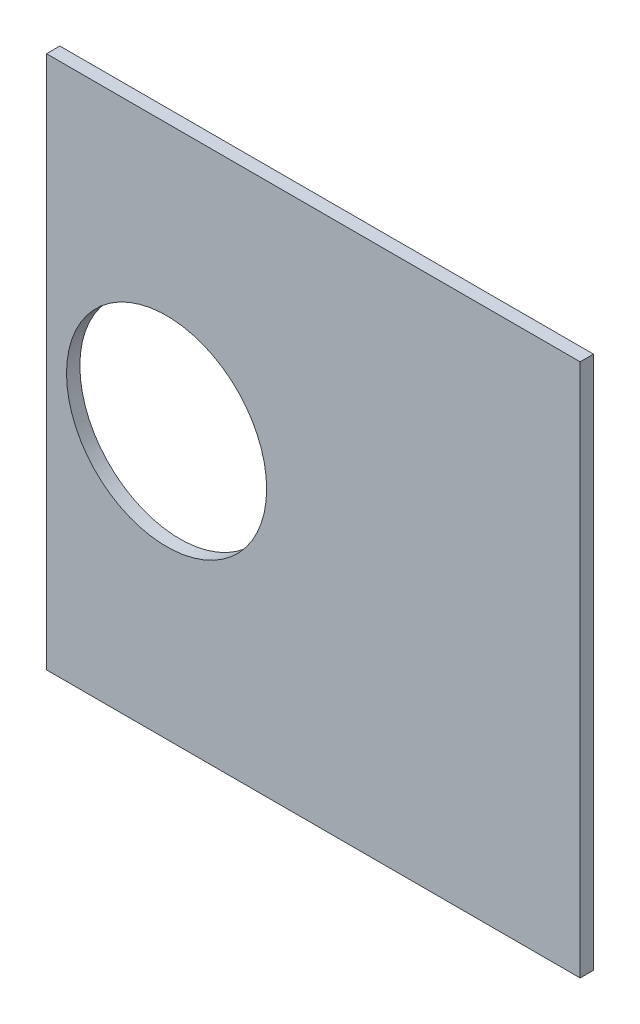
ISO-10303-21;
HEADER;
FILE_DESCRIPTION(('STEP AP214'),'2;1');
FILE_NAME('part.step','',(''),(''),'','','');
FILE_SCHEMA(('AUTOMOTIVE_DESIGN { 1 0 10303 214 1 1 1 1 }'));
ENDSEC;
DATA;
#1=APPLICATION_CONTEXT('core data for automotive mechanical design processes');
#2=APPLICATION_PROTOCOL_DEFINITION('international standard','automotive_design',2000,#1);
#3=PRODUCT_CONTEXT('',#1,'mechanical');
#4=PRODUCT('Part','Part','',(#3));
#5=PRODUCT_RELATED_PRODUCT_CATEGORY('part','',(#4));
#6=PRODUCT_DEFINITION_FORMATION('','',#4);
#7=PRODUCT_DEFINITION_CONTEXT('part definition',#1,'design');
#8=PRODUCT_DEFINITION('design','',#6,#7);
#9=PRODUCT_DEFINITION_SHAPE('','',#8);
#10=(LENGTH_UNIT() NAMED_UNIT(*) SI_UNIT(.MILLI.,.METRE.));
#11=(NAMED_UNIT(*) PLANE_ANGLE_UNIT() SI_UNIT($,.RADIAN.));
#12=(NAMED_UNIT(*) SI_UNIT($,.STERADIAN.) SOLID_ANGLE_UNIT());
#13=UNCERTAINTY_MEASURE_WITH_UNIT(LENGTH_MEASURE(1.E-05),#10,'distance_accuracy_value','');
#14=(GEOMETRIC_REPRESENTATION_CONTEXT(3) GLOBAL_UNCERTAINTY_ASSIGNED_CONTEXT((#13)) GLOBAL_UNIT_ASSIGNED_CONTEXT((#10,
#11,#12)) REPRESENTATION_CONTEXT('',''));
#15=CARTESIAN_POINT('',(0.,0.,0.));
#16=DIRECTION('',(0.,0.,1.));
#17=DIRECTION('',(1.,0.,0.));
#18=AXIS2_PLACEMENT_3D('',#15,#16,#17);
#19=CARTESIAN_POINT('',(200.,-200.,10.));
#20=DIRECTION('',(-1.,0.,0.));
#21=DIRECTION('',(0.,0.,1.));
#22=AXIS2_PLACEMENT_3D('',#19,#20,#21);
#23=PLANE('',#22);
#24=DIRECTION('',(0.,1.,0.));
#25=VECTOR('',#24,1.);
#26=CARTESIAN_POINT('',(200.,-200.,0.));
#27=LINE('',#26,#25);
#28=CARTESIAN_POINT('',(200.,-200.,0.));
#29=VERTEX_POINT('',#28);
#30=CARTESIAN_POINT('',(200.,200.,0.));
#31=VERTEX_POINT('',#30);
#32=EDGE_CURVE('E102',#29,#31,#27,.T.);
#33=ORIENTED_EDGE('',*,*,#32,.T.);
#34=DIRECTION('',(0.,0.,-1.));
#35=VECTOR('',#34,1.);
#36=CARTESIAN_POINT('',(200.,200.,10.));
#37=LINE('',#36,#35);
#38=CARTESIAN_POINT('',(200.,200.,10.));
#39=VERTEX_POINT('',#38);
#40=EDGE_CURVE('E11',#39,#31,#37,.T.);
#41=ORIENTED_EDGE('',*,*,#40,.F.);
#42=DIRECTION('',(0.,1.,0.));
#43=VECTOR('',#42,1.);
#44=CARTESIAN_POINT('',(200.,-200.,10.));
#45=LINE('',#44,#43);
#46=CARTESIAN_POINT('',(200.,-200.,10.));
#47=VERTEX_POINT('',#46);
#48=EDGE_CURVE('E90',#47,#39,#45,.T.);
#49=ORIENTED_EDGE('',*,*,#48,.F.);
#50=DIRECTION('',(0.,0.,-1.));
#51=VECTOR('',#50,1.);
#52=CARTESIAN_POINT('',(200.,-200.,10.));
#53=LINE('',#52,#51);
#54=EDGE_CURVE('E98',#47,#29,#53,.T.);
#55=ORIENTED_EDGE('',*,*,#54,.T.);
#56=EDGE_LOOP('',(#33,#41,#49,#55));
#57=FACE_BOUND('',#56,.T.);
#58=ADVANCED_FACE('F39',(#57),#23,.F.);
#59=CARTESIAN_POINT('',(-200.,200.,10.));
#60=DIRECTION('',(0.,-1.,0.));
#61=DIRECTION('',(0.,0.,-1.));
#62=AXIS2_PLACEMENT_3D('',#59,#60,#61);
#63=PLANE('',#62);
#64=DIRECTION('',(-1.,0.,0.));
#65=VECTOR('',#64,1.);
#66=CARTESIAN_POINT('',(-200.,200.,0.));
#67=LINE('',#66,#65);
#68=CARTESIAN_POINT('',(-200.,200.,0.));
#69=VERTEX_POINT('',#68);
#70=EDGE_CURVE('E94',#31,#69,#67,.T.);
#71=ORIENTED_EDGE('',*,*,#70,.T.);
#72=DIRECTION('',(0.,0.,-1.));
#73=VECTOR('',#72,1.);
#74=CARTESIAN_POINT('',(-200.,200.,10.));
#75=LINE('',#74,#73);
#76=CARTESIAN_POINT('',(-200.,200.,10.));
#77=VERTEX_POINT('',#76);
#78=EDGE_CURVE('E47',#77,#69,#75,.T.);
#79=ORIENTED_EDGE('',*,*,#78,.F.);
#80=DIRECTION('',(-1.,0.,0.));
#81=VECTOR('',#80,1.);
#82=CARTESIAN_POINT('',(-200.,200.,10.));
#83=LINE('',#82,#81);
#84=EDGE_CURVE('E85',#39,#77,#83,.T.);
#85=ORIENTED_EDGE('',*,*,#84,.F.);
#86=ORIENTED_EDGE('',*,*,#40,.T.);
#87=EDGE_LOOP('',(#71,#79,#85,#86));
#88=FACE_BOUND('',#87,.T.);
#89=ADVANCED_FACE('F93',(#88),#63,.F.);
#90=CARTESIAN_POINT('',(-200.,-200.,10.));
#91=DIRECTION('',(1.,0.,0.));
#92=DIRECTION('',(0.,0.,-1.));
#93=AXIS2_PLACEMENT_3D('',#90,#91,#92);
#94=PLANE('',#93);
#95=DIRECTION('',(0.,-1.,0.));
#96=VECTOR('',#95,1.);
#97=CARTESIAN_POINT('',(-200.,-200.,0.));
#98=LINE('',#97,#96);
#99=CARTESIAN_POINT('',(-200.,-200.,0.));
#100=VERTEX_POINT('',#99);
#101=EDGE_CURVE('E72',#69,#100,#98,.T.);
#102=ORIENTED_EDGE('',*,*,#101,.T.);
#103=DIRECTION('',(0.,0.,-1.));
#104=VECTOR('',#103,1.);
#105=CARTESIAN_POINT('',(-200.,-200.,10.));
#106=LINE('',#105,#104);
#107=CARTESIAN_POINT('',(-200.,-200.,10.));
#108=VERTEX_POINT('',#107);
#109=EDGE_CURVE('E95',#108,#100,#106,.T.);
#110=ORIENTED_EDGE('',*,*,#109,.F.);
#111=DIRECTION('',(0.,-1.,0.));
#112=VECTOR('',#111,1.);
#113=CARTESIAN_POINT('',(-200.,-200.,10.));
#114=LINE('',#113,#112);
#115=EDGE_CURVE('E88',#77,#108,#114,.T.);
#116=ORIENTED_EDGE('',*,*,#115,.F.);
#117=ORIENTED_EDGE('',*,*,#78,.T.);
#118=EDGE_LOOP('',(#102,#110,#116,#117));
#119=FACE_BOUND('',#118,.T.);
#120=ADVANCED_FACE('F96',(#119),#94,.F.);
#121=CARTESIAN_POINT('',(-200.,-200.,10.));
#122=DIRECTION('',(0.,1.,0.));
#123=DIRECTION('',(0.,0.,1.));
#124=AXIS2_PLACEMENT_3D('',#121,#122,#123);
#125=PLANE('',#124);
#126=DIRECTION('',(1.,0.,0.));
#127=VECTOR('',#126,1.);
#128=CARTESIAN_POINT('',(-200.,-200.,0.));
#129=LINE('',#128,#127);
#130=EDGE_CURVE('E78',#100,#29,#129,.T.);
#131=ORIENTED_EDGE('',*,*,#130,.T.);
#132=ORIENTED_EDGE('',*,*,#54,.F.);
#133=DIRECTION('',(1.,0.,0.));
#134=VECTOR('',#133,1.);
#135=CARTESIAN_POINT('',(-200.,-200.,10.));
#136=LINE('',#135,#134);
#137=EDGE_CURVE('E55',#108,#47,#136,.T.);
#138=ORIENTED_EDGE('',*,*,#137,.F.);
#139=ORIENTED_EDGE('',*,*,#109,.T.);
#140=EDGE_LOOP('',(#131,#132,#138,#139));
#141=FACE_BOUND('',#140,.T.);
#142=ADVANCED_FACE('F110',(#141),#125,.F.);
#143=CARTESIAN_POINT('',(0.,0.,10.));
#144=DIRECTION('',(0.,0.,-1.));
#145=DIRECTION('',(-1.,0.,0.));
#146=AXIS2_PLACEMENT_3D('',#143,#144,#145);
#147=PLANE('',#146);
#148=CARTESIAN_POINT('',(-110.,0.,10.));
#149=DIRECTION('',(0.,0.,1.));
#150=DIRECTION('',(1.,0.,0.));
#151=AXIS2_PLACEMENT_3D('',#148,#149,#150);
#152=CIRCLE('',#151,75.);
#153=CARTESIAN_POINT('',(-35.,0.,10.));
#154=VERTEX_POINT('',#153);
#155=EDGE_CURVE('E116',#154,#154,#152,.T.);
#156=ORIENTED_EDGE('',*,*,#155,.F.);
#157=EDGE_LOOP('',(#156));
#158=FACE_BOUND('',#157,.T.);
#159=ORIENTED_EDGE('',*,*,#48,.T.);
#160=ORIENTED_EDGE('',*,*,#84,.T.);
#161=ORIENTED_EDGE('',*,*,#115,.T.);
#162=ORIENTED_EDGE('',*,*,#137,.T.);
#163=EDGE_LOOP('',(#159,#160,#161,#162));
#164=FACE_BOUND('',#163,.T.);
#165=ADVANCED_FACE('F86',(#158,#164),#147,.F.);
#166=CARTESIAN_POINT('',(0.,0.,0.));
#167=DIRECTION('',(0.,0.,-1.));
#168=DIRECTION('',(-1.,0.,0.));
#169=AXIS2_PLACEMENT_3D('',#166,#167,#168);
#170=PLANE('',#169);
#171=CARTESIAN_POINT('',(-110.,0.,0.));
#172=DIRECTION('',(0.,0.,1.));
#173=DIRECTION('',(1.,0.,0.));
#174=AXIS2_PLACEMENT_3D('',#171,#172,#173);
#175=CIRCLE('',#174,75.);
#176=CARTESIAN_POINT('',(-35.,0.,0.));
#177=VERTEX_POINT('',#176);
#178=EDGE_CURVE('E105',#177,#177,#175,.T.);
#179=ORIENTED_EDGE('',*,*,#178,.T.);
#180=EDGE_LOOP('',(#179));
#181=FACE_BOUND('',#180,.T.);
#182=ORIENTED_EDGE('',*,*,#32,.F.);
#183=ORIENTED_EDGE('',*,*,#130,.F.);
#184=ORIENTED_EDGE('',*,*,#101,.F.);
#185=ORIENTED_EDGE('',*,*,#70,.F.);
#186=EDGE_LOOP('',(#182,#183,#184,#185));
#187=FACE_BOUND('',#186,.T.);
#188=ADVANCED_FACE('F113',(#181,#187),#170,.T.);
#189=CARTESIAN_POINT('',(-110.,0.,0.));
#190=DIRECTION('',(0.,0.,1.));
#191=DIRECTION('',(1.,0.,0.));
#192=AXIS2_PLACEMENT_3D('',#189,#190,#191);
#193=CYLINDRICAL_SURFACE('',#192,75.);
#194=ORIENTED_EDGE('',*,*,#178,.F.);
#195=EDGE_LOOP('',(#194));
#196=FACE_BOUND('',#195,.T.);
#197=ORIENTED_EDGE('',*,*,#155,.T.);
#198=EDGE_LOOP('',(#197));
#199=FACE_BOUND('',#198,.T.);
#200=ADVANCED_FACE('F123',(#196,#199),#193,.F.);
#201=CLOSED_SHELL('',(#58,#89,#120,#142,#165,#188,#200));
#202=MANIFOLD_SOLID_BREP('B2',#201);
#203=ADVANCED_BREP_SHAPE_REPRESENTATION('',(#18,#202),#14);
#204=SHAPE_DEFINITION_REPRESENTATION(#9,#203);
ENDSEC;
END-ISO-10303-21;
